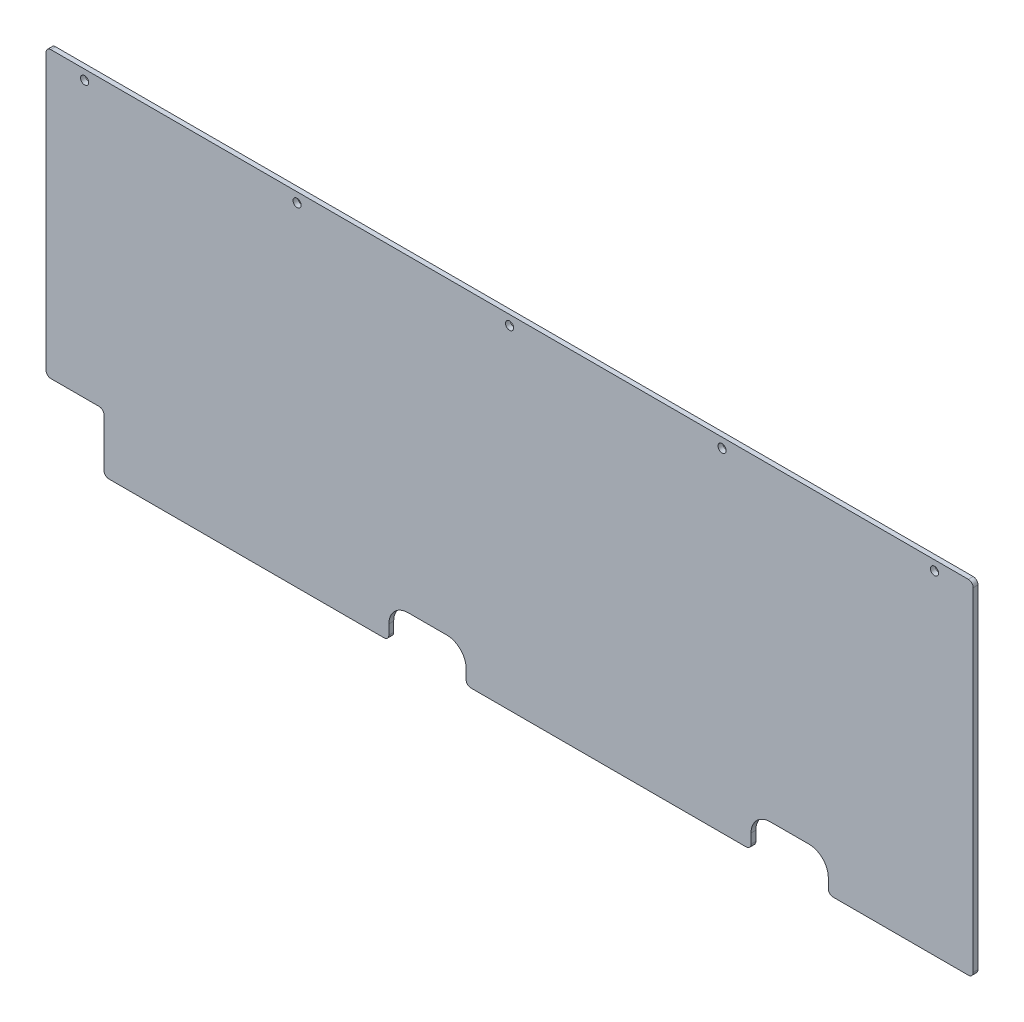
ISO-10303-21;
HEADER;
FILE_DESCRIPTION(('STEP AP214'),'2;1');
FILE_NAME('part.step','',(''),(''),'','','');
FILE_SCHEMA(('AUTOMOTIVE_DESIGN { 1 0 10303 214 1 1 1 1 }'));
ENDSEC;
DATA;
#1=APPLICATION_CONTEXT('core data for automotive mechanical design processes');
#2=APPLICATION_PROTOCOL_DEFINITION('international standard','automotive_design',2000,#1);
#3=PRODUCT_CONTEXT('',#1,'mechanical');
#4=PRODUCT('Part','Part','',(#3));
#5=PRODUCT_RELATED_PRODUCT_CATEGORY('part','',(#4));
#6=PRODUCT_DEFINITION_FORMATION('','',#4);
#7=PRODUCT_DEFINITION_CONTEXT('part definition',#1,'design');
#8=PRODUCT_DEFINITION('design','',#6,#7);
#9=PRODUCT_DEFINITION_SHAPE('','',#8);
#10=(LENGTH_UNIT() NAMED_UNIT(*) SI_UNIT(.MILLI.,.METRE.));
#11=(NAMED_UNIT(*) PLANE_ANGLE_UNIT() SI_UNIT($,.RADIAN.));
#12=(NAMED_UNIT(*) SI_UNIT($,.STERADIAN.) SOLID_ANGLE_UNIT());
#13=UNCERTAINTY_MEASURE_WITH_UNIT(LENGTH_MEASURE(1.E-05),#10,'distance_accuracy_value','');
#14=(GEOMETRIC_REPRESENTATION_CONTEXT(3) GLOBAL_UNCERTAINTY_ASSIGNED_CONTEXT((#13)) GLOBAL_UNIT_ASSIGNED_CONTEXT((#10,
#11,#12)) REPRESENTATION_CONTEXT('',''));
#15=CARTESIAN_POINT('',(0.,0.,0.));
#16=DIRECTION('',(0.,0.,1.));
#17=DIRECTION('',(1.,0.,0.));
#18=AXIS2_PLACEMENT_3D('',#15,#16,#17);
#19=CARTESIAN_POINT('',(0.,0.,6.35));
#20=DIRECTION('',(0.,0.,-1.));
#21=DIRECTION('',(-1.,0.,0.));
#22=AXIS2_PLACEMENT_3D('',#19,#20,#21);
#23=PLANE('',#22);
#24=DIRECTION('',(0.,1.,0.));
#25=VECTOR('',#24,1.);
#26=CARTESIAN_POINT('',(1219.2,0.,6.35));
#27=LINE('',#26,#25);
#28=CARTESIAN_POINT('',(1219.2,6.35,6.35));
#29=VERTEX_POINT('',#28);
#30=CARTESIAN_POINT('',(1219.2,444.5,6.35));
#31=VERTEX_POINT('',#30);
#32=EDGE_CURVE('E315',#29,#31,#27,.T.);
#33=ORIENTED_EDGE('',*,*,#32,.T.);
#34=CARTESIAN_POINT('',(1212.85,444.5,6.35));
#35=DIRECTION('',(0.,0.,-1.));
#36=DIRECTION('',(-1.,0.,0.));
#37=AXIS2_PLACEMENT_3D('',#34,#35,#36);
#38=CIRCLE('',#37,6.35);
#39=CARTESIAN_POINT('',(1212.85,450.85,6.35));
#40=VERTEX_POINT('',#39);
#41=EDGE_CURVE('E387',#31,#40,#38,.F.);
#42=ORIENTED_EDGE('',*,*,#41,.T.);
#43=DIRECTION('',(-1.,0.,0.));
#44=VECTOR('',#43,1.);
#45=CARTESIAN_POINT('',(0.,450.85,6.35));
#46=LINE('',#45,#44);
#47=CARTESIAN_POINT('',(6.35,450.85,6.35));
#48=VERTEX_POINT('',#47);
#49=EDGE_CURVE('E318',#40,#48,#46,.T.);
#50=ORIENTED_EDGE('',*,*,#49,.T.);
#51=CARTESIAN_POINT('',(6.35,444.5,6.35));
#52=DIRECTION('',(0.,0.,-1.));
#53=DIRECTION('',(-1.,0.,0.));
#54=AXIS2_PLACEMENT_3D('',#51,#52,#53);
#55=CIRCLE('',#54,6.35);
#56=CARTESIAN_POINT('',(0.,444.5,6.35));
#57=VERTEX_POINT('',#56);
#58=EDGE_CURVE('E372',#48,#57,#55,.F.);
#59=ORIENTED_EDGE('',*,*,#58,.T.);
#60=DIRECTION('',(0.,-1.,0.));
#61=VECTOR('',#60,1.);
#62=CARTESIAN_POINT('',(0.,0.,6.35));
#63=LINE('',#62,#61);
#64=CARTESIAN_POINT('',(0.,82.55,6.35));
#65=VERTEX_POINT('',#64);
#66=EDGE_CURVE('E307',#57,#65,#63,.T.);
#67=ORIENTED_EDGE('',*,*,#66,.T.);
#68=CARTESIAN_POINT('',(6.35,82.55,6.35));
#69=DIRECTION('',(0.,0.,-1.));
#70=DIRECTION('',(-1.,0.,0.));
#71=AXIS2_PLACEMENT_3D('',#68,#69,#70);
#72=CIRCLE('',#71,6.35);
#73=CARTESIAN_POINT('',(6.35,76.2,6.35));
#74=VERTEX_POINT('',#73);
#75=EDGE_CURVE('E374',#65,#74,#72,.F.);
#76=ORIENTED_EDGE('',*,*,#75,.T.);
#77=DIRECTION('',(-1.,0.,0.));
#78=VECTOR('',#77,1.);
#79=CARTESIAN_POINT('',(0.,76.2,6.35));
#80=LINE('',#79,#78);
#81=CARTESIAN_POINT('',(69.85,76.2,6.35));
#82=VERTEX_POINT('',#81);
#83=EDGE_CURVE('E440',#82,#74,#80,.T.);
#84=ORIENTED_EDGE('',*,*,#83,.F.);
#85=CARTESIAN_POINT('',(69.85,69.85,6.35));
#86=DIRECTION('',(0.,0.,-1.));
#87=DIRECTION('',(-1.,0.,0.));
#88=AXIS2_PLACEMENT_3D('',#85,#86,#87);
#89=CIRCLE('',#88,6.35);
#90=CARTESIAN_POINT('',(76.2,69.85,6.35));
#91=VERTEX_POINT('',#90);
#92=EDGE_CURVE('E339',#82,#91,#89,.T.);
#93=ORIENTED_EDGE('',*,*,#92,.T.);
#94=DIRECTION('',(0.,1.,0.));
#95=VECTOR('',#94,1.);
#96=CARTESIAN_POINT('',(76.2,0.,6.35));
#97=LINE('',#96,#95);
#98=CARTESIAN_POINT('',(76.2,6.35,6.35));
#99=VERTEX_POINT('',#98);
#100=EDGE_CURVE('E442',#99,#91,#97,.T.);
#101=ORIENTED_EDGE('',*,*,#100,.F.);
#102=CARTESIAN_POINT('',(82.55,6.35,6.35));
#103=DIRECTION('',(0.,0.,-1.));
#104=DIRECTION('',(-1.,0.,0.));
#105=AXIS2_PLACEMENT_3D('',#102,#103,#104);
#106=CIRCLE('',#105,6.35);
#107=CARTESIAN_POINT('',(82.55,0.,6.35));
#108=VERTEX_POINT('',#107);
#109=EDGE_CURVE('E376',#99,#108,#106,.F.);
#110=ORIENTED_EDGE('',*,*,#109,.T.);
#111=DIRECTION('',(1.,0.,0.));
#112=VECTOR('',#111,1.);
#113=CARTESIAN_POINT('',(0.,0.,6.35));
#114=LINE('',#113,#112);
#115=CARTESIAN_POINT('',(444.5,0.,6.35));
#116=VERTEX_POINT('',#115);
#117=EDGE_CURVE('E314',#108,#116,#114,.T.);
#118=ORIENTED_EDGE('',*,*,#117,.T.);
#119=CARTESIAN_POINT('',(444.5,6.35,6.35));
#120=DIRECTION('',(0.,0.,-1.));
#121=DIRECTION('',(-1.,0.,0.));
#122=AXIS2_PLACEMENT_3D('',#119,#120,#121);
#123=CIRCLE('',#122,6.35);
#124=CARTESIAN_POINT('',(450.85,6.35,6.35));
#125=VERTEX_POINT('',#124);
#126=EDGE_CURVE('E378',#116,#125,#123,.F.);
#127=ORIENTED_EDGE('',*,*,#126,.T.);
#128=DIRECTION('',(0.,-1.,0.));
#129=VECTOR('',#128,1.);
#130=CARTESIAN_POINT('',(450.85,19.05,6.35));
#131=LINE('',#130,#129);
#132=CARTESIAN_POINT('',(450.85,19.05,6.35));
#133=VERTEX_POINT('',#132);
#134=EDGE_CURVE('E273',#133,#125,#131,.T.);
#135=ORIENTED_EDGE('',*,*,#134,.F.);
#136=CARTESIAN_POINT('',(476.25,19.05,6.35));
#137=DIRECTION('',(0.,0.,1.));
#138=DIRECTION('',(1.,0.,0.));
#139=AXIS2_PLACEMENT_3D('',#136,#137,#138);
#140=CIRCLE('',#139,25.4);
#141=CARTESIAN_POINT('',(476.25,44.45,6.35));
#142=VERTEX_POINT('',#141);
#143=EDGE_CURVE('E293',#142,#133,#140,.T.);
#144=ORIENTED_EDGE('',*,*,#143,.F.);
#145=DIRECTION('',(-1.,0.,0.));
#146=VECTOR('',#145,1.);
#147=CARTESIAN_POINT('',(476.25,44.45,6.35));
#148=LINE('',#147,#146);
#149=CARTESIAN_POINT('',(527.05,44.45,6.35));
#150=VERTEX_POINT('',#149);
#151=EDGE_CURVE('E290',#150,#142,#148,.T.);
#152=ORIENTED_EDGE('',*,*,#151,.F.);
#153=CARTESIAN_POINT('',(527.05,19.05,6.35));
#154=DIRECTION('',(0.,0.,1.));
#155=DIRECTION('',(1.,0.,0.));
#156=AXIS2_PLACEMENT_3D('',#153,#154,#155);
#157=CIRCLE('',#156,25.4);
#158=CARTESIAN_POINT('',(552.45,19.05,6.35));
#159=VERTEX_POINT('',#158);
#160=EDGE_CURVE('E287',#159,#150,#157,.T.);
#161=ORIENTED_EDGE('',*,*,#160,.F.);
#162=DIRECTION('',(0.,1.,0.));
#163=VECTOR('',#162,1.);
#164=CARTESIAN_POINT('',(552.45,0.,6.35));
#165=LINE('',#164,#163);
#166=CARTESIAN_POINT('',(552.45,6.35,6.35));
#167=VERTEX_POINT('',#166);
#168=EDGE_CURVE('E267',#167,#159,#165,.T.);
#169=ORIENTED_EDGE('',*,*,#168,.F.);
#170=CARTESIAN_POINT('',(558.8,6.35,6.35));
#171=DIRECTION('',(0.,0.,-1.));
#172=DIRECTION('',(-1.,0.,0.));
#173=AXIS2_PLACEMENT_3D('',#170,#171,#172);
#174=CIRCLE('',#173,6.35);
#175=CARTESIAN_POINT('',(558.8,0.,6.35));
#176=VERTEX_POINT('',#175);
#177=EDGE_CURVE('E380',#167,#176,#174,.F.);
#178=ORIENTED_EDGE('',*,*,#177,.T.);
#179=CARTESIAN_POINT('',(920.75,0.,6.35));
#180=VERTEX_POINT('',#179);
#181=EDGE_CURVE('E313',#176,#180,#114,.T.);
#182=ORIENTED_EDGE('',*,*,#181,.T.);
#183=CARTESIAN_POINT('',(920.75,6.35,6.35));
#184=DIRECTION('',(0.,0.,-1.));
#185=DIRECTION('',(-1.,0.,0.));
#186=AXIS2_PLACEMENT_3D('',#183,#184,#185);
#187=CIRCLE('',#186,6.35);
#188=CARTESIAN_POINT('',(927.1,6.35,6.35));
#189=VERTEX_POINT('',#188);
#190=EDGE_CURVE('E382',#180,#189,#187,.F.);
#191=ORIENTED_EDGE('',*,*,#190,.T.);
#192=DIRECTION('',(0.,-1.,0.));
#193=VECTOR('',#192,1.);
#194=CARTESIAN_POINT('',(927.1,19.05,6.35));
#195=LINE('',#194,#193);
#196=CARTESIAN_POINT('',(927.1,19.05,6.35));
#197=VERTEX_POINT('',#196);
#198=EDGE_CURVE('E246',#197,#189,#195,.T.);
#199=ORIENTED_EDGE('',*,*,#198,.F.);
#200=CARTESIAN_POINT('',(952.5,19.05,6.35));
#201=DIRECTION('',(0.,0.,1.));
#202=DIRECTION('',(1.,0.,0.));
#203=AXIS2_PLACEMENT_3D('',#200,#201,#202);
#204=CIRCLE('',#203,25.4);
#205=CARTESIAN_POINT('',(952.5,44.45,6.35));
#206=VERTEX_POINT('',#205);
#207=EDGE_CURVE('E260',#206,#197,#204,.T.);
#208=ORIENTED_EDGE('',*,*,#207,.F.);
#209=DIRECTION('',(-1.,0.,0.));
#210=VECTOR('',#209,1.);
#211=CARTESIAN_POINT('',(952.5,44.45,6.35));
#212=LINE('',#211,#210);
#213=CARTESIAN_POINT('',(1003.3,44.45,6.35));
#214=VERTEX_POINT('',#213);
#215=EDGE_CURVE('E258',#214,#206,#212,.T.);
#216=ORIENTED_EDGE('',*,*,#215,.F.);
#217=CARTESIAN_POINT('',(1003.3,19.05,6.35));
#218=DIRECTION('',(0.,0.,1.));
#219=DIRECTION('',(1.,0.,0.));
#220=AXIS2_PLACEMENT_3D('',#217,#218,#219);
#221=CIRCLE('',#220,25.4);
#222=CARTESIAN_POINT('',(1028.7,19.05,6.35));
#223=VERTEX_POINT('',#222);
#224=EDGE_CURVE('E226',#223,#214,#221,.T.);
#225=ORIENTED_EDGE('',*,*,#224,.F.);
#226=DIRECTION('',(0.,1.,0.));
#227=VECTOR('',#226,1.);
#228=CARTESIAN_POINT('',(1028.7,0.,6.35));
#229=LINE('',#228,#227);
#230=CARTESIAN_POINT('',(1028.7,6.35,6.35));
#231=VERTEX_POINT('',#230);
#232=EDGE_CURVE('E254',#231,#223,#229,.T.);
#233=ORIENTED_EDGE('',*,*,#232,.F.);
#234=CARTESIAN_POINT('',(1035.05,6.35,6.35));
#235=DIRECTION('',(0.,0.,-1.));
#236=DIRECTION('',(-1.,0.,0.));
#237=AXIS2_PLACEMENT_3D('',#234,#235,#236);
#238=CIRCLE('',#237,6.35);
#239=CARTESIAN_POINT('',(1035.05,0.,6.35));
#240=VERTEX_POINT('',#239);
#241=EDGE_CURVE('E55',#231,#240,#238,.F.);
#242=ORIENTED_EDGE('',*,*,#241,.T.);
#243=CARTESIAN_POINT('',(1212.85,0.,6.35));
#244=VERTEX_POINT('',#243);
#245=EDGE_CURVE('E310',#240,#244,#114,.T.);
#246=ORIENTED_EDGE('',*,*,#245,.T.);
#247=CARTESIAN_POINT('',(1212.85,6.35,6.35));
#248=DIRECTION('',(0.,0.,-1.));
#249=DIRECTION('',(-1.,0.,0.));
#250=AXIS2_PLACEMENT_3D('',#247,#248,#249);
#251=CIRCLE('',#250,6.35);
#252=EDGE_CURVE('E385',#244,#29,#251,.F.);
#253=ORIENTED_EDGE('',*,*,#252,.T.);
#254=EDGE_LOOP('',(#33,#42,#50,#59,#67,#76,#84,#93,#101,#110,#118,#127,#135,#144,#152,#161,#169,
#178,#182,#191,#199,#208,#216,#225,#233,#242,#246,#253));
#255=FACE_BOUND('',#254,.T.);
#256=CARTESIAN_POINT('',(1168.4,438.15,6.35));
#257=DIRECTION('',(0.,0.,1.));
#258=DIRECTION('',(1.,0.,0.));
#259=AXIS2_PLACEMENT_3D('',#256,#257,#258);
#260=CIRCLE('',#259,5.35787599999993);
#261=CARTESIAN_POINT('',(1173.757876,438.15,6.35));
#262=VERTEX_POINT('',#261);
#263=EDGE_CURVE('E450',#262,#262,#260,.T.);
#264=ORIENTED_EDGE('',*,*,#263,.F.);
#265=EDGE_LOOP('',(#264));
#266=FACE_BOUND('',#265,.T.);
#267=CARTESIAN_POINT('',(889.,438.15,6.35));
#268=DIRECTION('',(0.,0.,1.));
#269=DIRECTION('',(1.,0.,0.));
#270=AXIS2_PLACEMENT_3D('',#267,#268,#269);
#271=CIRCLE('',#270,5.35787600000004);
#272=CARTESIAN_POINT('',(894.357876,438.15,6.35));
#273=VERTEX_POINT('',#272);
#274=EDGE_CURVE('E456',#273,#273,#271,.T.);
#275=ORIENTED_EDGE('',*,*,#274,.F.);
#276=EDGE_LOOP('',(#275));
#277=FACE_BOUND('',#276,.T.);
#278=CARTESIAN_POINT('',(609.6,438.15,6.35));
#279=DIRECTION('',(0.,0.,1.));
#280=DIRECTION('',(1.,0.,0.));
#281=AXIS2_PLACEMENT_3D('',#278,#279,#280);
#282=CIRCLE('',#281,5.35787600000004);
#283=CARTESIAN_POINT('',(614.957876,438.15,6.35));
#284=VERTEX_POINT('',#283);
#285=EDGE_CURVE('E462',#284,#284,#282,.T.);
#286=ORIENTED_EDGE('',*,*,#285,.F.);
#287=EDGE_LOOP('',(#286));
#288=FACE_BOUND('',#287,.T.);
#289=CARTESIAN_POINT('',(330.2,438.15,6.35));
#290=DIRECTION('',(0.,0.,1.));
#291=DIRECTION('',(1.,0.,0.));
#292=AXIS2_PLACEMENT_3D('',#289,#290,#291);
#293=CIRCLE('',#292,5.35787599999998);
#294=CARTESIAN_POINT('',(335.557876,438.15,6.35));
#295=VERTEX_POINT('',#294);
#296=EDGE_CURVE('E468',#295,#295,#293,.T.);
#297=ORIENTED_EDGE('',*,*,#296,.F.);
#298=EDGE_LOOP('',(#297));
#299=FACE_BOUND('',#298,.T.);
#300=CARTESIAN_POINT('',(50.8,438.15,6.35));
#301=DIRECTION('',(0.,0.,1.));
#302=DIRECTION('',(1.,0.,0.));
#303=AXIS2_PLACEMENT_3D('',#300,#301,#302);
#304=CIRCLE('',#303,5.357876);
#305=CARTESIAN_POINT('',(56.157876,438.15,6.35));
#306=VERTEX_POINT('',#305);
#307=EDGE_CURVE('E474',#306,#306,#304,.T.);
#308=ORIENTED_EDGE('',*,*,#307,.F.);
#309=EDGE_LOOP('',(#308));
#310=FACE_BOUND('',#309,.T.);
#311=ADVANCED_FACE('F33',(#255,#266,#277,#288,#299,#310),#23,.F.);
#312=CARTESIAN_POINT('',(0.,0.,6.35));
#313=DIRECTION('',(0.,1.,0.));
#314=DIRECTION('',(0.,0.,1.));
#315=AXIS2_PLACEMENT_3D('',#312,#313,#314);
#316=PLANE('',#315);
#317=DIRECTION('',(1.,0.,0.));
#318=VECTOR('',#317,1.);
#319=CARTESIAN_POINT('',(0.,0.,0.));
#320=LINE('',#319,#318);
#321=CARTESIAN_POINT('',(558.8,0.,0.));
#322=VERTEX_POINT('',#321);
#323=CARTESIAN_POINT('',(920.75,0.,0.));
#324=VERTEX_POINT('',#323);
#325=EDGE_CURVE('E329',#322,#324,#320,.T.);
#326=ORIENTED_EDGE('',*,*,#325,.T.);
#327=DIRECTION('',(0.,0.,1.));
#328=VECTOR('',#327,1.);
#329=CARTESIAN_POINT('',(920.75,0.,6.35));
#330=LINE('',#329,#328);
#331=EDGE_CURVE('E397',#324,#180,#330,.T.);
#332=ORIENTED_EDGE('',*,*,#331,.T.);
#333=ORIENTED_EDGE('',*,*,#181,.F.);
#334=DIRECTION('',(0.,0.,1.));
#335=VECTOR('',#334,1.);
#336=CARTESIAN_POINT('',(558.8,0.,6.35));
#337=LINE('',#336,#335);
#338=EDGE_CURVE('E395',#176,#322,#337,.F.);
#339=ORIENTED_EDGE('',*,*,#338,.T.);
#340=EDGE_LOOP('',(#326,#332,#333,#339));
#341=FACE_BOUND('',#340,.T.);
#342=ADVANCED_FACE('F482',(#341),#316,.F.);
#343=CARTESIAN_POINT('',(82.55,0.,0.));
#344=VERTEX_POINT('',#343);
#345=CARTESIAN_POINT('',(444.5,0.,0.));
#346=VERTEX_POINT('',#345);
#347=EDGE_CURVE('E325',#344,#346,#320,.T.);
#348=ORIENTED_EDGE('',*,*,#347,.T.);
#349=DIRECTION('',(0.,0.,1.));
#350=VECTOR('',#349,1.);
#351=CARTESIAN_POINT('',(444.5,0.,6.35));
#352=LINE('',#351,#350);
#353=EDGE_CURVE('E407',#346,#116,#352,.T.);
#354=ORIENTED_EDGE('',*,*,#353,.T.);
#355=ORIENTED_EDGE('',*,*,#117,.F.);
#356=DIRECTION('',(0.,0.,1.));
#357=VECTOR('',#356,1.);
#358=CARTESIAN_POINT('',(82.55,0.,6.35));
#359=LINE('',#358,#357);
#360=EDGE_CURVE('E405',#108,#344,#359,.F.);
#361=ORIENTED_EDGE('',*,*,#360,.T.);
#362=EDGE_LOOP('',(#348,#354,#355,#361));
#363=FACE_BOUND('',#362,.T.);
#364=ADVANCED_FACE('F488',(#363),#316,.F.);
#365=CARTESIAN_POINT('',(0.,0.,6.35));
#366=DIRECTION('',(1.,0.,0.));
#367=DIRECTION('',(0.,0.,-1.));
#368=AXIS2_PLACEMENT_3D('',#365,#366,#367);
#369=PLANE('',#368);
#370=DIRECTION('',(0.,-1.,0.));
#371=VECTOR('',#370,1.);
#372=CARTESIAN_POINT('',(0.,0.,0.));
#373=LINE('',#372,#371);
#374=CARTESIAN_POINT('',(0.,444.5,0.));
#375=VERTEX_POINT('',#374);
#376=CARTESIAN_POINT('',(0.,82.55,0.));
#377=VERTEX_POINT('',#376);
#378=EDGE_CURVE('E300',#375,#377,#373,.T.);
#379=ORIENTED_EDGE('',*,*,#378,.T.);
#380=DIRECTION('',(0.,0.,1.));
#381=VECTOR('',#380,1.);
#382=CARTESIAN_POINT('',(0.,82.55,6.35));
#383=LINE('',#382,#381);
#384=EDGE_CURVE('E41',#377,#65,#383,.T.);
#385=ORIENTED_EDGE('',*,*,#384,.T.);
#386=ORIENTED_EDGE('',*,*,#66,.F.);
#387=DIRECTION('',(0.,0.,-1.));
#388=VECTOR('',#387,1.);
#389=CARTESIAN_POINT('',(0.,444.5,6.35));
#390=LINE('',#389,#388);
#391=EDGE_CURVE('E415',#57,#375,#390,.T.);
#392=ORIENTED_EDGE('',*,*,#391,.T.);
#393=EDGE_LOOP('',(#379,#385,#386,#392));
#394=FACE_BOUND('',#393,.T.);
#395=ADVANCED_FACE('F421',(#394),#369,.F.);
#396=CARTESIAN_POINT('',(1035.05,0.,0.));
#397=VERTEX_POINT('',#396);
#398=CARTESIAN_POINT('',(1212.85,0.,0.));
#399=VERTEX_POINT('',#398);
#400=EDGE_CURVE('E324',#397,#399,#320,.T.);
#401=ORIENTED_EDGE('',*,*,#400,.T.);
#402=DIRECTION('',(0.,0.,-1.));
#403=VECTOR('',#402,1.);
#404=CARTESIAN_POINT('',(1212.85,0.,6.35));
#405=LINE('',#404,#403);
#406=EDGE_CURVE('E48',#399,#244,#405,.F.);
#407=ORIENTED_EDGE('',*,*,#406,.T.);
#408=ORIENTED_EDGE('',*,*,#245,.F.);
#409=DIRECTION('',(0.,0.,1.));
#410=VECTOR('',#409,1.);
#411=CARTESIAN_POINT('',(1035.05,0.,6.35));
#412=LINE('',#411,#410);
#413=EDGE_CURVE('E389',#240,#397,#412,.F.);
#414=ORIENTED_EDGE('',*,*,#413,.T.);
#415=EDGE_LOOP('',(#401,#407,#408,#414));
#416=FACE_BOUND('',#415,.T.);
#417=ADVANCED_FACE('F491',(#416),#316,.F.);
#418=CARTESIAN_POINT('',(1219.2,0.,6.35));
#419=DIRECTION('',(-1.,0.,0.));
#420=DIRECTION('',(0.,0.,1.));
#421=AXIS2_PLACEMENT_3D('',#418,#419,#420);
#422=PLANE('',#421);
#423=DIRECTION('',(0.,1.,0.));
#424=VECTOR('',#423,1.);
#425=CARTESIAN_POINT('',(1219.2,0.,0.));
#426=LINE('',#425,#424);
#427=CARTESIAN_POINT('',(1219.2,6.35,0.));
#428=VERTEX_POINT('',#427);
#429=CARTESIAN_POINT('',(1219.2,444.5,0.));
#430=VERTEX_POINT('',#429);
#431=EDGE_CURVE('E328',#428,#430,#426,.T.);
#432=ORIENTED_EDGE('',*,*,#431,.T.);
#433=DIRECTION('',(0.,0.,-1.));
#434=VECTOR('',#433,1.);
#435=CARTESIAN_POINT('',(1219.2,444.5,6.35));
#436=LINE('',#435,#434);
#437=EDGE_CURVE('E370',#430,#31,#436,.F.);
#438=ORIENTED_EDGE('',*,*,#437,.T.);
#439=ORIENTED_EDGE('',*,*,#32,.F.);
#440=DIRECTION('',(0.,0.,-1.));
#441=VECTOR('',#440,1.);
#442=CARTESIAN_POINT('',(1219.2,6.35,6.35));
#443=LINE('',#442,#441);
#444=EDGE_CURVE('E367',#29,#428,#443,.T.);
#445=ORIENTED_EDGE('',*,*,#444,.T.);
#446=EDGE_LOOP('',(#432,#438,#439,#445));
#447=FACE_BOUND('',#446,.T.);
#448=ADVANCED_FACE('F503',(#447),#422,.F.);
#449=CARTESIAN_POINT('',(0.,450.85,6.35));
#450=DIRECTION('',(0.,-1.,0.));
#451=DIRECTION('',(0.,0.,-1.));
#452=AXIS2_PLACEMENT_3D('',#449,#450,#451);
#453=PLANE('',#452);
#454=ORIENTED_EDGE('',*,*,#49,.F.);
#455=DIRECTION('',(0.,0.,-1.));
#456=VECTOR('',#455,1.);
#457=CARTESIAN_POINT('',(1212.85,450.85,6.35));
#458=LINE('',#457,#456);
#459=CARTESIAN_POINT('',(1212.85,450.85,0.));
#460=VERTEX_POINT('',#459);
#461=EDGE_CURVE('E346',#40,#460,#458,.T.);
#462=ORIENTED_EDGE('',*,*,#461,.T.);
#463=DIRECTION('',(-1.,0.,0.));
#464=VECTOR('',#463,1.);
#465=CARTESIAN_POINT('',(0.,450.85,0.));
#466=LINE('',#465,#464);
#467=CARTESIAN_POINT('',(6.35,450.85,0.));
#468=VERTEX_POINT('',#467);
#469=EDGE_CURVE('E311',#460,#468,#466,.T.);
#470=ORIENTED_EDGE('',*,*,#469,.T.);
#471=DIRECTION('',(0.,0.,-1.));
#472=VECTOR('',#471,1.);
#473=CARTESIAN_POINT('',(6.35,450.85,6.35));
#474=LINE('',#473,#472);
#475=EDGE_CURVE('E344',#468,#48,#474,.F.);
#476=ORIENTED_EDGE('',*,*,#475,.T.);
#477=EDGE_LOOP('',(#454,#462,#470,#476));
#478=FACE_BOUND('',#477,.T.);
#479=ADVANCED_FACE('F499',(#478),#453,.F.);
#480=CARTESIAN_POINT('',(0.,0.,0.));
#481=DIRECTION('',(0.,0.,-1.));
#482=DIRECTION('',(-1.,0.,0.));
#483=AXIS2_PLACEMENT_3D('',#480,#481,#482);
#484=PLANE('',#483);
#485=CARTESIAN_POINT('',(50.8,438.15,0.));
#486=DIRECTION('',(0.,0.,-1.));
#487=DIRECTION('',(-1.,0.,0.));
#488=AXIS2_PLACEMENT_3D('',#485,#486,#487);
#489=CIRCLE('',#488,5.357876);
#490=CARTESIAN_POINT('',(45.442124,438.15,0.));
#491=VERTEX_POINT('',#490);
#492=EDGE_CURVE('E471',#491,#491,#489,.T.);
#493=ORIENTED_EDGE('',*,*,#492,.F.);
#494=EDGE_LOOP('',(#493));
#495=FACE_BOUND('',#494,.T.);
#496=CARTESIAN_POINT('',(330.2,438.15,0.));
#497=DIRECTION('',(0.,0.,-1.));
#498=DIRECTION('',(-1.,0.,0.));
#499=AXIS2_PLACEMENT_3D('',#496,#497,#498);
#500=CIRCLE('',#499,5.35787599999998);
#501=CARTESIAN_POINT('',(324.842124,438.15,0.));
#502=VERTEX_POINT('',#501);
#503=EDGE_CURVE('E465',#502,#502,#500,.T.);
#504=ORIENTED_EDGE('',*,*,#503,.F.);
#505=EDGE_LOOP('',(#504));
#506=FACE_BOUND('',#505,.T.);
#507=CARTESIAN_POINT('',(609.6,438.15,0.));
#508=DIRECTION('',(0.,0.,-1.));
#509=DIRECTION('',(-1.,0.,0.));
#510=AXIS2_PLACEMENT_3D('',#507,#508,#509);
#511=CIRCLE('',#510,5.35787600000004);
#512=CARTESIAN_POINT('',(604.242124,438.15,0.));
#513=VERTEX_POINT('',#512);
#514=EDGE_CURVE('E459',#513,#513,#511,.T.);
#515=ORIENTED_EDGE('',*,*,#514,.F.);
#516=EDGE_LOOP('',(#515));
#517=FACE_BOUND('',#516,.T.);
#518=CARTESIAN_POINT('',(889.,438.15,0.));
#519=DIRECTION('',(0.,0.,-1.));
#520=DIRECTION('',(-1.,0.,0.));
#521=AXIS2_PLACEMENT_3D('',#518,#519,#520);
#522=CIRCLE('',#521,5.35787600000004);
#523=CARTESIAN_POINT('',(883.642124,438.15,0.));
#524=VERTEX_POINT('',#523);
#525=EDGE_CURVE('E453',#524,#524,#522,.T.);
#526=ORIENTED_EDGE('',*,*,#525,.F.);
#527=EDGE_LOOP('',(#526));
#528=FACE_BOUND('',#527,.T.);
#529=CARTESIAN_POINT('',(1168.4,438.15,0.));
#530=DIRECTION('',(0.,0.,-1.));
#531=DIRECTION('',(-1.,0.,0.));
#532=AXIS2_PLACEMENT_3D('',#529,#530,#531);
#533=CIRCLE('',#532,5.35787599999993);
#534=CARTESIAN_POINT('',(1163.042124,438.15,0.));
#535=VERTEX_POINT('',#534);
#536=EDGE_CURVE('E444',#535,#535,#533,.T.);
#537=ORIENTED_EDGE('',*,*,#536,.F.);
#538=EDGE_LOOP('',(#537));
#539=FACE_BOUND('',#538,.T.);
#540=ORIENTED_EDGE('',*,*,#469,.F.);
#541=CARTESIAN_POINT('',(1212.85,444.5,0.));
#542=DIRECTION('',(0.,0.,-1.));
#543=DIRECTION('',(-1.,0.,0.));
#544=AXIS2_PLACEMENT_3D('',#541,#542,#543);
#545=CIRCLE('',#544,6.35);
#546=EDGE_CURVE('E365',#460,#430,#545,.T.);
#547=ORIENTED_EDGE('',*,*,#546,.T.);
#548=ORIENTED_EDGE('',*,*,#431,.F.);
#549=CARTESIAN_POINT('',(1212.85,6.35,0.));
#550=DIRECTION('',(0.,0.,-1.));
#551=DIRECTION('',(-1.,0.,0.));
#552=AXIS2_PLACEMENT_3D('',#549,#550,#551);
#553=CIRCLE('',#552,6.35);
#554=EDGE_CURVE('E363',#428,#399,#553,.T.);
#555=ORIENTED_EDGE('',*,*,#554,.T.);
#556=ORIENTED_EDGE('',*,*,#400,.F.);
#557=CARTESIAN_POINT('',(1035.05,6.35,0.));
#558=DIRECTION('',(0.,0.,-1.));
#559=DIRECTION('',(-1.,0.,0.));
#560=AXIS2_PLACEMENT_3D('',#557,#558,#559);
#561=CIRCLE('',#560,6.35);
#562=CARTESIAN_POINT('',(1028.7,6.35,0.));
#563=VERTEX_POINT('',#562);
#564=EDGE_CURVE('E361',#397,#563,#561,.T.);
#565=ORIENTED_EDGE('',*,*,#564,.T.);
#566=DIRECTION('',(0.,1.,0.));
#567=VECTOR('',#566,1.);
#568=CARTESIAN_POINT('',(1028.7,0.,0.));
#569=LINE('',#568,#567);
#570=CARTESIAN_POINT('',(1028.7,19.05,0.));
#571=VERTEX_POINT('',#570);
#572=EDGE_CURVE('E244',#563,#571,#569,.T.);
#573=ORIENTED_EDGE('',*,*,#572,.T.);
#574=CARTESIAN_POINT('',(1003.3,19.05,0.));
#575=DIRECTION('',(0.,0.,1.));
#576=DIRECTION('',(1.,0.,0.));
#577=AXIS2_PLACEMENT_3D('',#574,#575,#576);
#578=CIRCLE('',#577,25.4);
#579=CARTESIAN_POINT('',(1003.3,44.45,0.));
#580=VERTEX_POINT('',#579);
#581=EDGE_CURVE('E223',#571,#580,#578,.T.);
#582=ORIENTED_EDGE('',*,*,#581,.T.);
#583=DIRECTION('',(-1.,0.,0.));
#584=VECTOR('',#583,1.);
#585=CARTESIAN_POINT('',(952.5,44.45,0.));
#586=LINE('',#585,#584);
#587=CARTESIAN_POINT('',(952.5,44.45,0.));
#588=VERTEX_POINT('',#587);
#589=EDGE_CURVE('E234',#580,#588,#586,.T.);
#590=ORIENTED_EDGE('',*,*,#589,.T.);
#591=CARTESIAN_POINT('',(952.5,19.05,0.));
#592=DIRECTION('',(0.,0.,1.));
#593=DIRECTION('',(1.,0.,0.));
#594=AXIS2_PLACEMENT_3D('',#591,#592,#593);
#595=CIRCLE('',#594,25.4);
#596=CARTESIAN_POINT('',(927.1,19.05,0.));
#597=VERTEX_POINT('',#596);
#598=EDGE_CURVE('E239',#588,#597,#595,.T.);
#599=ORIENTED_EDGE('',*,*,#598,.T.);
#600=DIRECTION('',(0.,-1.,0.));
#601=VECTOR('',#600,1.);
#602=CARTESIAN_POINT('',(927.1,19.05,0.));
#603=LINE('',#602,#601);
#604=CARTESIAN_POINT('',(927.1,6.35,0.));
#605=VERTEX_POINT('',#604);
#606=EDGE_CURVE('E251',#597,#605,#603,.T.);
#607=ORIENTED_EDGE('',*,*,#606,.T.);
#608=CARTESIAN_POINT('',(920.75,6.35,0.));
#609=DIRECTION('',(0.,0.,-1.));
#610=DIRECTION('',(-1.,0.,0.));
#611=AXIS2_PLACEMENT_3D('',#608,#609,#610);
#612=CIRCLE('',#611,6.35);
#613=EDGE_CURVE('E359',#605,#324,#612,.T.);
#614=ORIENTED_EDGE('',*,*,#613,.T.);
#615=ORIENTED_EDGE('',*,*,#325,.F.);
#616=CARTESIAN_POINT('',(558.8,6.35,0.));
#617=DIRECTION('',(0.,0.,-1.));
#618=DIRECTION('',(-1.,0.,0.));
#619=AXIS2_PLACEMENT_3D('',#616,#617,#618);
#620=CIRCLE('',#619,6.35);
#621=CARTESIAN_POINT('',(552.45,6.35,0.));
#622=VERTEX_POINT('',#621);
#623=EDGE_CURVE('E357',#322,#622,#620,.T.);
#624=ORIENTED_EDGE('',*,*,#623,.T.);
#625=DIRECTION('',(0.,1.,0.));
#626=VECTOR('',#625,1.);
#627=CARTESIAN_POINT('',(552.45,0.,0.));
#628=LINE('',#627,#626);
#629=CARTESIAN_POINT('',(552.45,19.05,0.));
#630=VERTEX_POINT('',#629);
#631=EDGE_CURVE('E270',#622,#630,#628,.T.);
#632=ORIENTED_EDGE('',*,*,#631,.T.);
#633=CARTESIAN_POINT('',(527.05,19.05,0.));
#634=DIRECTION('',(0.,0.,1.));
#635=DIRECTION('',(1.,0.,0.));
#636=AXIS2_PLACEMENT_3D('',#633,#634,#635);
#637=CIRCLE('',#636,25.4);
#638=CARTESIAN_POINT('',(527.05,44.45,0.));
#639=VERTEX_POINT('',#638);
#640=EDGE_CURVE('E272',#630,#639,#637,.T.);
#641=ORIENTED_EDGE('',*,*,#640,.T.);
#642=DIRECTION('',(-1.,0.,0.));
#643=VECTOR('',#642,1.);
#644=CARTESIAN_POINT('',(476.25,44.45,0.));
#645=LINE('',#644,#643);
#646=CARTESIAN_POINT('',(476.25,44.45,0.));
#647=VERTEX_POINT('',#646);
#648=EDGE_CURVE('E276',#639,#647,#645,.T.);
#649=ORIENTED_EDGE('',*,*,#648,.T.);
#650=CARTESIAN_POINT('',(476.25,19.05,0.));
#651=DIRECTION('',(0.,0.,1.));
#652=DIRECTION('',(1.,0.,0.));
#653=AXIS2_PLACEMENT_3D('',#650,#651,#652);
#654=CIRCLE('',#653,25.4);
#655=CARTESIAN_POINT('',(450.85,19.05,0.));
#656=VERTEX_POINT('',#655);
#657=EDGE_CURVE('E279',#647,#656,#654,.T.);
#658=ORIENTED_EDGE('',*,*,#657,.T.);
#659=DIRECTION('',(0.,-1.,0.));
#660=VECTOR('',#659,1.);
#661=CARTESIAN_POINT('',(450.85,19.05,0.));
#662=LINE('',#661,#660);
#663=CARTESIAN_POINT('',(450.85,6.35,0.));
#664=VERTEX_POINT('',#663);
#665=EDGE_CURVE('E282',#656,#664,#662,.T.);
#666=ORIENTED_EDGE('',*,*,#665,.T.);
#667=CARTESIAN_POINT('',(444.5,6.35,0.));
#668=DIRECTION('',(0.,0.,-1.));
#669=DIRECTION('',(-1.,0.,0.));
#670=AXIS2_PLACEMENT_3D('',#667,#668,#669);
#671=CIRCLE('',#670,6.35);
#672=EDGE_CURVE('E355',#664,#346,#671,.T.);
#673=ORIENTED_EDGE('',*,*,#672,.T.);
#674=ORIENTED_EDGE('',*,*,#347,.F.);
#675=CARTESIAN_POINT('',(82.55,6.35,0.));
#676=DIRECTION('',(0.,0.,-1.));
#677=DIRECTION('',(-1.,0.,0.));
#678=AXIS2_PLACEMENT_3D('',#675,#676,#677);
#679=CIRCLE('',#678,6.35);
#680=CARTESIAN_POINT('',(76.2,6.35,0.));
#681=VERTEX_POINT('',#680);
#682=EDGE_CURVE('E353',#344,#681,#679,.T.);
#683=ORIENTED_EDGE('',*,*,#682,.T.);
#684=DIRECTION('',(0.,1.,0.));
#685=VECTOR('',#684,1.);
#686=CARTESIAN_POINT('',(76.2,0.,0.));
#687=LINE('',#686,#685);
#688=CARTESIAN_POINT('',(76.2,69.85,0.));
#689=VERTEX_POINT('',#688);
#690=EDGE_CURVE('E441',#681,#689,#687,.T.);
#691=ORIENTED_EDGE('',*,*,#690,.T.);
#692=CARTESIAN_POINT('',(69.85,69.85,0.));
#693=DIRECTION('',(0.,0.,-1.));
#694=DIRECTION('',(-1.,0.,0.));
#695=AXIS2_PLACEMENT_3D('',#692,#693,#694);
#696=CIRCLE('',#695,6.35);
#697=CARTESIAN_POINT('',(69.85,76.2,0.));
#698=VERTEX_POINT('',#697);
#699=EDGE_CURVE('E342',#689,#698,#696,.F.);
#700=ORIENTED_EDGE('',*,*,#699,.T.);
#701=DIRECTION('',(-1.,0.,0.));
#702=VECTOR('',#701,1.);
#703=CARTESIAN_POINT('',(0.,76.2,0.));
#704=LINE('',#703,#702);
#705=CARTESIAN_POINT('',(6.35,76.2,0.));
#706=VERTEX_POINT('',#705);
#707=EDGE_CURVE('E256',#698,#706,#704,.T.);
#708=ORIENTED_EDGE('',*,*,#707,.T.);
#709=CARTESIAN_POINT('',(6.35,82.55,0.));
#710=DIRECTION('',(0.,0.,-1.));
#711=DIRECTION('',(-1.,0.,0.));
#712=AXIS2_PLACEMENT_3D('',#709,#710,#711);
#713=CIRCLE('',#712,6.35);
#714=EDGE_CURVE('E351',#706,#377,#713,.T.);
#715=ORIENTED_EDGE('',*,*,#714,.T.);
#716=ORIENTED_EDGE('',*,*,#378,.F.);
#717=CARTESIAN_POINT('',(6.35,444.5,0.));
#718=DIRECTION('',(0.,0.,-1.));
#719=DIRECTION('',(-1.,0.,0.));
#720=AXIS2_PLACEMENT_3D('',#717,#718,#719);
#721=CIRCLE('',#720,6.35);
#722=EDGE_CURVE('E349',#375,#468,#721,.T.);
#723=ORIENTED_EDGE('',*,*,#722,.T.);
#724=EDGE_LOOP('',(#540,#547,#548,#555,#556,#565,#573,#582,#590,#599,#607,#614,#615,#624,#632,
#641,#649,#658,#666,#673,#674,#683,#691,#700,#708,#715,#716,#723));
#725=FACE_BOUND('',#724,.T.);
#726=ADVANCED_FACE('F242',(#495,#506,#517,#528,#539,#725),#484,.T.);
#727=CARTESIAN_POINT('',(450.85,19.05,0.));
#728=DIRECTION('',(-1.,0.,0.));
#729=DIRECTION('',(0.,0.,1.));
#730=AXIS2_PLACEMENT_3D('',#727,#728,#729);
#731=PLANE('',#730);
#732=ORIENTED_EDGE('',*,*,#134,.T.);
#733=DIRECTION('',(0.,0.,1.));
#734=VECTOR('',#733,1.);
#735=CARTESIAN_POINT('',(450.85,6.35,0.));
#736=LINE('',#735,#734);
#737=EDGE_CURVE('E410',#125,#664,#736,.F.);
#738=ORIENTED_EDGE('',*,*,#737,.T.);
#739=ORIENTED_EDGE('',*,*,#665,.F.);
#740=DIRECTION('',(0.,0.,1.));
#741=VECTOR('',#740,1.);
#742=CARTESIAN_POINT('',(450.85,19.05,0.));
#743=LINE('',#742,#741);
#744=EDGE_CURVE('E298',#656,#133,#743,.T.);
#745=ORIENTED_EDGE('',*,*,#744,.T.);
#746=EDGE_LOOP('',(#732,#738,#739,#745));
#747=FACE_BOUND('',#746,.T.);
#748=ADVANCED_FACE('F498',(#747),#731,.F.);
#749=CARTESIAN_POINT('',(476.25,19.05,0.));
#750=DIRECTION('',(0.,0.,1.));
#751=DIRECTION('',(1.,0.,0.));
#752=AXIS2_PLACEMENT_3D('',#749,#750,#751);
#753=CYLINDRICAL_SURFACE('',#752,25.4);
#754=ORIENTED_EDGE('',*,*,#143,.T.);
#755=ORIENTED_EDGE('',*,*,#744,.F.);
#756=ORIENTED_EDGE('',*,*,#657,.F.);
#757=DIRECTION('',(0.,0.,1.));
#758=VECTOR('',#757,1.);
#759=CARTESIAN_POINT('',(476.25,44.45,0.));
#760=LINE('',#759,#758);
#761=EDGE_CURVE('E301',#647,#142,#760,.T.);
#762=ORIENTED_EDGE('',*,*,#761,.T.);
#763=EDGE_LOOP('',(#754,#755,#756,#762));
#764=FACE_BOUND('',#763,.T.);
#765=ADVANCED_FACE('F645',(#764),#753,.F.);
#766=CARTESIAN_POINT('',(476.25,44.45,0.));
#767=DIRECTION('',(0.,1.,0.));
#768=DIRECTION('',(0.,0.,1.));
#769=AXIS2_PLACEMENT_3D('',#766,#767,#768);
#770=PLANE('',#769);
#771=ORIENTED_EDGE('',*,*,#151,.T.);
#772=ORIENTED_EDGE('',*,*,#761,.F.);
#773=ORIENTED_EDGE('',*,*,#648,.F.);
#774=DIRECTION('',(0.,0.,1.));
#775=VECTOR('',#774,1.);
#776=CARTESIAN_POINT('',(527.05,44.45,0.));
#777=LINE('',#776,#775);
#778=EDGE_CURVE('E303',#639,#150,#777,.T.);
#779=ORIENTED_EDGE('',*,*,#778,.T.);
#780=EDGE_LOOP('',(#771,#772,#773,#779));
#781=FACE_BOUND('',#780,.T.);
#782=ADVANCED_FACE('F770',(#781),#770,.F.);
#783=CARTESIAN_POINT('',(527.05,19.05,0.));
#784=DIRECTION('',(0.,0.,1.));
#785=DIRECTION('',(1.,0.,0.));
#786=AXIS2_PLACEMENT_3D('',#783,#784,#785);
#787=CYLINDRICAL_SURFACE('',#786,25.4);
#788=ORIENTED_EDGE('',*,*,#160,.T.);
#789=ORIENTED_EDGE('',*,*,#778,.F.);
#790=ORIENTED_EDGE('',*,*,#640,.F.);
#791=DIRECTION('',(0.,0.,1.));
#792=VECTOR('',#791,1.);
#793=CARTESIAN_POINT('',(552.45,19.05,0.));
#794=LINE('',#793,#792);
#795=EDGE_CURVE('E285',#630,#159,#794,.T.);
#796=ORIENTED_EDGE('',*,*,#795,.T.);
#797=EDGE_LOOP('',(#788,#789,#790,#796));
#798=FACE_BOUND('',#797,.T.);
#799=ADVANCED_FACE('F638',(#798),#787,.F.);
#800=CARTESIAN_POINT('',(552.45,0.,0.));
#801=DIRECTION('',(1.,0.,0.));
#802=DIRECTION('',(0.,0.,-1.));
#803=AXIS2_PLACEMENT_3D('',#800,#801,#802);
#804=PLANE('',#803);
#805=ORIENTED_EDGE('',*,*,#631,.F.);
#806=DIRECTION('',(0.,0.,1.));
#807=VECTOR('',#806,1.);
#808=CARTESIAN_POINT('',(552.45,6.35,0.));
#809=LINE('',#808,#807);
#810=EDGE_CURVE('E402',#622,#167,#809,.T.);
#811=ORIENTED_EDGE('',*,*,#810,.T.);
#812=ORIENTED_EDGE('',*,*,#168,.T.);
#813=ORIENTED_EDGE('',*,*,#795,.F.);
#814=EDGE_LOOP('',(#805,#811,#812,#813));
#815=FACE_BOUND('',#814,.T.);
#816=ADVANCED_FACE('F494',(#815),#804,.F.);
#817=CARTESIAN_POINT('',(927.1,19.05,0.));
#818=DIRECTION('',(-1.,0.,0.));
#819=DIRECTION('',(0.,0.,1.));
#820=AXIS2_PLACEMENT_3D('',#817,#818,#819);
#821=PLANE('',#820);
#822=ORIENTED_EDGE('',*,*,#198,.T.);
#823=DIRECTION('',(0.,0.,1.));
#824=VECTOR('',#823,1.);
#825=CARTESIAN_POINT('',(927.1,6.35,0.));
#826=LINE('',#825,#824);
#827=EDGE_CURVE('E400',#189,#605,#826,.F.);
#828=ORIENTED_EDGE('',*,*,#827,.T.);
#829=ORIENTED_EDGE('',*,*,#606,.F.);
#830=DIRECTION('',(0.,0.,1.));
#831=VECTOR('',#830,1.);
#832=CARTESIAN_POINT('',(927.1,19.05,0.));
#833=LINE('',#832,#831);
#834=EDGE_CURVE('E265',#597,#197,#833,.T.);
#835=ORIENTED_EDGE('',*,*,#834,.T.);
#836=EDGE_LOOP('',(#822,#828,#829,#835));
#837=FACE_BOUND('',#836,.T.);
#838=ADVANCED_FACE('F625',(#837),#821,.F.);
#839=CARTESIAN_POINT('',(952.5,19.05,0.));
#840=DIRECTION('',(0.,0.,1.));
#841=DIRECTION('',(1.,0.,0.));
#842=AXIS2_PLACEMENT_3D('',#839,#840,#841);
#843=CYLINDRICAL_SURFACE('',#842,25.4);
#844=ORIENTED_EDGE('',*,*,#207,.T.);
#845=ORIENTED_EDGE('',*,*,#834,.F.);
#846=ORIENTED_EDGE('',*,*,#598,.F.);
#847=DIRECTION('',(0.,0.,1.));
#848=VECTOR('',#847,1.);
#849=CARTESIAN_POINT('',(952.5,44.45,0.));
#850=LINE('',#849,#848);
#851=EDGE_CURVE('E230',#588,#206,#850,.T.);
#852=ORIENTED_EDGE('',*,*,#851,.T.);
#853=EDGE_LOOP('',(#844,#845,#846,#852));
#854=FACE_BOUND('',#853,.T.);
#855=ADVANCED_FACE('F629',(#854),#843,.F.);
#856=CARTESIAN_POINT('',(952.5,44.45,0.));
#857=DIRECTION('',(0.,1.,0.));
#858=DIRECTION('',(0.,0.,1.));
#859=AXIS2_PLACEMENT_3D('',#856,#857,#858);
#860=PLANE('',#859);
#861=ORIENTED_EDGE('',*,*,#215,.T.);
#862=ORIENTED_EDGE('',*,*,#851,.F.);
#863=ORIENTED_EDGE('',*,*,#589,.F.);
#864=DIRECTION('',(0.,0.,1.));
#865=VECTOR('',#864,1.);
#866=CARTESIAN_POINT('',(1003.3,44.45,0.));
#867=LINE('',#866,#865);
#868=EDGE_CURVE('E218',#580,#214,#867,.T.);
#869=ORIENTED_EDGE('',*,*,#868,.T.);
#870=EDGE_LOOP('',(#861,#862,#863,#869));
#871=FACE_BOUND('',#870,.T.);
#872=ADVANCED_FACE('F235',(#871),#860,.F.);
#873=CARTESIAN_POINT('',(1003.3,19.05,0.));
#874=DIRECTION('',(0.,0.,1.));
#875=DIRECTION('',(1.,0.,0.));
#876=AXIS2_PLACEMENT_3D('',#873,#874,#875);
#877=CYLINDRICAL_SURFACE('',#876,25.4);
#878=ORIENTED_EDGE('',*,*,#224,.T.);
#879=ORIENTED_EDGE('',*,*,#868,.F.);
#880=ORIENTED_EDGE('',*,*,#581,.F.);
#881=DIRECTION('',(0.,0.,1.));
#882=VECTOR('',#881,1.);
#883=CARTESIAN_POINT('',(1028.7,19.05,0.));
#884=LINE('',#883,#882);
#885=EDGE_CURVE('E231',#571,#223,#884,.T.);
#886=ORIENTED_EDGE('',*,*,#885,.T.);
#887=EDGE_LOOP('',(#878,#879,#880,#886));
#888=FACE_BOUND('',#887,.T.);
#889=ADVANCED_FACE('F220',(#888),#877,.F.);
#890=CARTESIAN_POINT('',(1028.7,0.,0.));
#891=DIRECTION('',(1.,0.,0.));
#892=DIRECTION('',(0.,0.,-1.));
#893=AXIS2_PLACEMENT_3D('',#890,#891,#892);
#894=PLANE('',#893);
#895=ORIENTED_EDGE('',*,*,#572,.F.);
#896=DIRECTION('',(0.,0.,1.));
#897=VECTOR('',#896,1.);
#898=CARTESIAN_POINT('',(1028.7,6.35,0.));
#899=LINE('',#898,#897);
#900=EDGE_CURVE('E392',#563,#231,#899,.T.);
#901=ORIENTED_EDGE('',*,*,#900,.T.);
#902=ORIENTED_EDGE('',*,*,#232,.T.);
#903=ORIENTED_EDGE('',*,*,#885,.F.);
#904=EDGE_LOOP('',(#895,#901,#902,#903));
#905=FACE_BOUND('',#904,.T.);
#906=ADVANCED_FACE('F613',(#905),#894,.F.);
#907=CARTESIAN_POINT('',(0.,76.2,0.));
#908=DIRECTION('',(0.,1.,0.));
#909=DIRECTION('',(0.,0.,1.));
#910=AXIS2_PLACEMENT_3D('',#907,#908,#909);
#911=PLANE('',#910);
#912=ORIENTED_EDGE('',*,*,#83,.T.);
#913=DIRECTION('',(0.,0.,1.));
#914=VECTOR('',#913,1.);
#915=CARTESIAN_POINT('',(6.35,76.2,0.));
#916=LINE('',#915,#914);
#917=EDGE_CURVE('E11',#74,#706,#916,.F.);
#918=ORIENTED_EDGE('',*,*,#917,.T.);
#919=ORIENTED_EDGE('',*,*,#707,.F.);
#920=DIRECTION('',(0.,0.,1.));
#921=VECTOR('',#920,1.);
#922=CARTESIAN_POINT('',(69.85,76.2,6.35));
#923=LINE('',#922,#921);
#924=EDGE_CURVE('E321',#698,#82,#923,.T.);
#925=ORIENTED_EDGE('',*,*,#924,.T.);
#926=EDGE_LOOP('',(#912,#918,#919,#925));
#927=FACE_BOUND('',#926,.T.);
#928=ADVANCED_FACE('F438',(#927),#911,.F.);
#929=CARTESIAN_POINT('',(76.2,0.,0.));
#930=DIRECTION('',(1.,0.,0.));
#931=DIRECTION('',(0.,0.,-1.));
#932=AXIS2_PLACEMENT_3D('',#929,#930,#931);
#933=PLANE('',#932);
#934=ORIENTED_EDGE('',*,*,#690,.F.);
#935=DIRECTION('',(0.,0.,1.));
#936=VECTOR('',#935,1.);
#937=CARTESIAN_POINT('',(76.2,6.35,0.));
#938=LINE('',#937,#936);
#939=EDGE_CURVE('E412',#681,#99,#938,.T.);
#940=ORIENTED_EDGE('',*,*,#939,.T.);
#941=ORIENTED_EDGE('',*,*,#100,.T.);
#942=DIRECTION('',(0.,0.,1.));
#943=VECTOR('',#942,1.);
#944=CARTESIAN_POINT('',(76.2,69.85,0.));
#945=LINE('',#944,#943);
#946=EDGE_CURVE('E336',#91,#689,#945,.F.);
#947=ORIENTED_EDGE('',*,*,#946,.T.);
#948=EDGE_LOOP('',(#934,#940,#941,#947));
#949=FACE_BOUND('',#948,.T.);
#950=ADVANCED_FACE('F515',(#949),#933,.F.);
#951=CARTESIAN_POINT('',(69.85,69.85,0.));
#952=DIRECTION('',(0.,0.,-1.));
#953=DIRECTION('',(-1.,0.,0.));
#954=AXIS2_PLACEMENT_3D('',#951,#952,#953);
#955=CYLINDRICAL_SURFACE('',#954,6.35);
#956=ORIENTED_EDGE('',*,*,#699,.F.);
#957=ORIENTED_EDGE('',*,*,#946,.F.);
#958=ORIENTED_EDGE('',*,*,#92,.F.);
#959=ORIENTED_EDGE('',*,*,#924,.F.);
#960=EDGE_LOOP('',(#956,#957,#958,#959));
#961=FACE_BOUND('',#960,.T.);
#962=ADVANCED_FACE('F511',(#961),#955,.F.);
#963=CARTESIAN_POINT('',(1168.4,438.15,6.35));
#964=DIRECTION('',(0.,0.,1.));
#965=DIRECTION('',(1.,0.,0.));
#966=AXIS2_PLACEMENT_3D('',#963,#964,#965);
#967=CYLINDRICAL_SURFACE('',#966,5.35787599999993);
#968=ORIENTED_EDGE('',*,*,#263,.T.);
#969=EDGE_LOOP('',(#968));
#970=FACE_BOUND('',#969,.T.);
#971=ORIENTED_EDGE('',*,*,#536,.T.);
#972=EDGE_LOOP('',(#971));
#973=FACE_BOUND('',#972,.T.);
#974=ADVANCED_FACE('F514',(#970,#973),#967,.F.);
#975=CARTESIAN_POINT('',(889.,438.15,6.35));
#976=DIRECTION('',(0.,0.,1.));
#977=DIRECTION('',(1.,0.,0.));
#978=AXIS2_PLACEMENT_3D('',#975,#976,#977);
#979=CYLINDRICAL_SURFACE('',#978,5.35787600000004);
#980=ORIENTED_EDGE('',*,*,#274,.T.);
#981=EDGE_LOOP('',(#980));
#982=FACE_BOUND('',#981,.T.);
#983=ORIENTED_EDGE('',*,*,#525,.T.);
#984=EDGE_LOOP('',(#983));
#985=FACE_BOUND('',#984,.T.);
#986=ADVANCED_FACE('F730',(#982,#985),#979,.F.);
#987=CARTESIAN_POINT('',(609.6,438.15,6.35));
#988=DIRECTION('',(0.,0.,1.));
#989=DIRECTION('',(1.,0.,0.));
#990=AXIS2_PLACEMENT_3D('',#987,#988,#989);
#991=CYLINDRICAL_SURFACE('',#990,5.35787600000004);
#992=ORIENTED_EDGE('',*,*,#285,.T.);
#993=EDGE_LOOP('',(#992));
#994=FACE_BOUND('',#993,.T.);
#995=ORIENTED_EDGE('',*,*,#514,.T.);
#996=EDGE_LOOP('',(#995));
#997=FACE_BOUND('',#996,.T.);
#998=ADVANCED_FACE('F739',(#994,#997),#991,.F.);
#999=CARTESIAN_POINT('',(330.2,438.15,6.35));
#1000=DIRECTION('',(0.,0.,1.));
#1001=DIRECTION('',(1.,0.,0.));
#1002=AXIS2_PLACEMENT_3D('',#999,#1000,#1001);
#1003=CYLINDRICAL_SURFACE('',#1002,5.35787599999998);
#1004=ORIENTED_EDGE('',*,*,#296,.T.);
#1005=EDGE_LOOP('',(#1004));
#1006=FACE_BOUND('',#1005,.T.);
#1007=ORIENTED_EDGE('',*,*,#503,.T.);
#1008=EDGE_LOOP('',(#1007));
#1009=FACE_BOUND('',#1008,.T.);
#1010=ADVANCED_FACE('F748',(#1006,#1009),#1003,.F.);
#1011=CARTESIAN_POINT('',(50.8,438.15,6.35));
#1012=DIRECTION('',(0.,0.,1.));
#1013=DIRECTION('',(1.,0.,0.));
#1014=AXIS2_PLACEMENT_3D('',#1011,#1012,#1013);
#1015=CYLINDRICAL_SURFACE('',#1014,5.357876);
#1016=ORIENTED_EDGE('',*,*,#307,.T.);
#1017=EDGE_LOOP('',(#1016));
#1018=FACE_BOUND('',#1017,.T.);
#1019=ORIENTED_EDGE('',*,*,#492,.T.);
#1020=EDGE_LOOP('',(#1019));
#1021=FACE_BOUND('',#1020,.T.);
#1022=ADVANCED_FACE('F478',(#1018,#1021),#1015,.F.);
#1023=CARTESIAN_POINT('',(1212.85,444.5,6.35));
#1024=DIRECTION('',(0.,0.,-1.));
#1025=DIRECTION('',(-1.,0.,0.));
#1026=AXIS2_PLACEMENT_3D('',#1023,#1024,#1025);
#1027=CYLINDRICAL_SURFACE('',#1026,6.35);
#1028=ORIENTED_EDGE('',*,*,#41,.F.);
#1029=ORIENTED_EDGE('',*,*,#437,.F.);
#1030=ORIENTED_EDGE('',*,*,#546,.F.);
#1031=ORIENTED_EDGE('',*,*,#461,.F.);
#1032=EDGE_LOOP('',(#1028,#1029,#1030,#1031));
#1033=FACE_BOUND('',#1032,.T.);
#1034=ADVANCED_FACE('F517',(#1033),#1027,.T.);
#1035=CARTESIAN_POINT('',(1212.85,6.35,6.35));
#1036=DIRECTION('',(0.,0.,-1.));
#1037=DIRECTION('',(-1.,0.,0.));
#1038=AXIS2_PLACEMENT_3D('',#1035,#1036,#1037);
#1039=CYLINDRICAL_SURFACE('',#1038,6.35);
#1040=ORIENTED_EDGE('',*,*,#252,.F.);
#1041=ORIENTED_EDGE('',*,*,#406,.F.);
#1042=ORIENTED_EDGE('',*,*,#554,.F.);
#1043=ORIENTED_EDGE('',*,*,#444,.F.);
#1044=EDGE_LOOP('',(#1040,#1041,#1042,#1043));
#1045=FACE_BOUND('',#1044,.T.);
#1046=ADVANCED_FACE('F520',(#1045),#1039,.T.);
#1047=CARTESIAN_POINT('',(1035.05,6.35,0.));
#1048=DIRECTION('',(0.,0.,1.));
#1049=DIRECTION('',(1.,0.,0.));
#1050=AXIS2_PLACEMENT_3D('',#1047,#1048,#1049);
#1051=CYLINDRICAL_SURFACE('',#1050,6.35);
#1052=ORIENTED_EDGE('',*,*,#564,.F.);
#1053=ORIENTED_EDGE('',*,*,#413,.F.);
#1054=ORIENTED_EDGE('',*,*,#241,.F.);
#1055=ORIENTED_EDGE('',*,*,#900,.F.);
#1056=EDGE_LOOP('',(#1052,#1053,#1054,#1055));
#1057=FACE_BOUND('',#1056,.T.);
#1058=ADVANCED_FACE('F524',(#1057),#1051,.T.);
#1059=CARTESIAN_POINT('',(920.75,6.35,6.35));
#1060=DIRECTION('',(0.,0.,1.));
#1061=DIRECTION('',(1.,0.,0.));
#1062=AXIS2_PLACEMENT_3D('',#1059,#1060,#1061);
#1063=CYLINDRICAL_SURFACE('',#1062,6.35);
#1064=ORIENTED_EDGE('',*,*,#613,.F.);
#1065=ORIENTED_EDGE('',*,*,#827,.F.);
#1066=ORIENTED_EDGE('',*,*,#190,.F.);
#1067=ORIENTED_EDGE('',*,*,#331,.F.);
#1068=EDGE_LOOP('',(#1064,#1065,#1066,#1067));
#1069=FACE_BOUND('',#1068,.T.);
#1070=ADVANCED_FACE('F528',(#1069),#1063,.T.);
#1071=CARTESIAN_POINT('',(558.8,6.35,0.));
#1072=DIRECTION('',(0.,0.,1.));
#1073=DIRECTION('',(1.,0.,0.));
#1074=AXIS2_PLACEMENT_3D('',#1071,#1072,#1073);
#1075=CYLINDRICAL_SURFACE('',#1074,6.35);
#1076=ORIENTED_EDGE('',*,*,#623,.F.);
#1077=ORIENTED_EDGE('',*,*,#338,.F.);
#1078=ORIENTED_EDGE('',*,*,#177,.F.);
#1079=ORIENTED_EDGE('',*,*,#810,.F.);
#1080=EDGE_LOOP('',(#1076,#1077,#1078,#1079));
#1081=FACE_BOUND('',#1080,.T.);
#1082=ADVANCED_FACE('F532',(#1081),#1075,.T.);
#1083=CARTESIAN_POINT('',(444.5,6.35,6.35));
#1084=DIRECTION('',(0.,0.,1.));
#1085=DIRECTION('',(1.,0.,0.));
#1086=AXIS2_PLACEMENT_3D('',#1083,#1084,#1085);
#1087=CYLINDRICAL_SURFACE('',#1086,6.35);
#1088=ORIENTED_EDGE('',*,*,#672,.F.);
#1089=ORIENTED_EDGE('',*,*,#737,.F.);
#1090=ORIENTED_EDGE('',*,*,#126,.F.);
#1091=ORIENTED_EDGE('',*,*,#353,.F.);
#1092=EDGE_LOOP('',(#1088,#1089,#1090,#1091));
#1093=FACE_BOUND('',#1092,.T.);
#1094=ADVANCED_FACE('F536',(#1093),#1087,.T.);
#1095=CARTESIAN_POINT('',(82.55,6.35,0.));
#1096=DIRECTION('',(0.,0.,1.));
#1097=DIRECTION('',(1.,0.,0.));
#1098=AXIS2_PLACEMENT_3D('',#1095,#1096,#1097);
#1099=CYLINDRICAL_SURFACE('',#1098,6.35);
#1100=ORIENTED_EDGE('',*,*,#682,.F.);
#1101=ORIENTED_EDGE('',*,*,#360,.F.);
#1102=ORIENTED_EDGE('',*,*,#109,.F.);
#1103=ORIENTED_EDGE('',*,*,#939,.F.);
#1104=EDGE_LOOP('',(#1100,#1101,#1102,#1103));
#1105=FACE_BOUND('',#1104,.T.);
#1106=ADVANCED_FACE('F540',(#1105),#1099,.T.);
#1107=CARTESIAN_POINT('',(6.35,82.55,6.35));
#1108=DIRECTION('',(0.,0.,1.));
#1109=DIRECTION('',(1.,0.,0.));
#1110=AXIS2_PLACEMENT_3D('',#1107,#1108,#1109);
#1111=CYLINDRICAL_SURFACE('',#1110,6.35);
#1112=ORIENTED_EDGE('',*,*,#714,.F.);
#1113=ORIENTED_EDGE('',*,*,#917,.F.);
#1114=ORIENTED_EDGE('',*,*,#75,.F.);
#1115=ORIENTED_EDGE('',*,*,#384,.F.);
#1116=EDGE_LOOP('',(#1112,#1113,#1114,#1115));
#1117=FACE_BOUND('',#1116,.T.);
#1118=ADVANCED_FACE('F436',(#1117),#1111,.T.);
#1119=CARTESIAN_POINT('',(6.35,444.5,6.35));
#1120=DIRECTION('',(0.,0.,-1.));
#1121=DIRECTION('',(-1.,0.,0.));
#1122=AXIS2_PLACEMENT_3D('',#1119,#1120,#1121);
#1123=CYLINDRICAL_SURFACE('',#1122,6.35);
#1124=ORIENTED_EDGE('',*,*,#58,.F.);
#1125=ORIENTED_EDGE('',*,*,#475,.F.);
#1126=ORIENTED_EDGE('',*,*,#722,.F.);
#1127=ORIENTED_EDGE('',*,*,#391,.F.);
#1128=EDGE_LOOP('',(#1124,#1125,#1126,#1127));
#1129=FACE_BOUND('',#1128,.T.);
#1130=ADVANCED_FACE('F35',(#1129),#1123,.T.);
#1131=CLOSED_SHELL('',(#311,#342,#364,#395,#417,#448,#479,#726,#748,#765,#782,#799,#816,#838,
#855,#872,#889,#906,#928,#950,#962,#974,#986,#998,#1010,#1022,#1034,#1046,#1058,#1070,#1082,
#1094,#1106,#1118,#1130));
#1132=MANIFOLD_SOLID_BREP('B2',#1131);
#1133=ADVANCED_BREP_SHAPE_REPRESENTATION('',(#18,#1132),#14);
#1134=SHAPE_DEFINITION_REPRESENTATION(#9,#1133);
ENDSEC;
END-ISO-10303-21;
